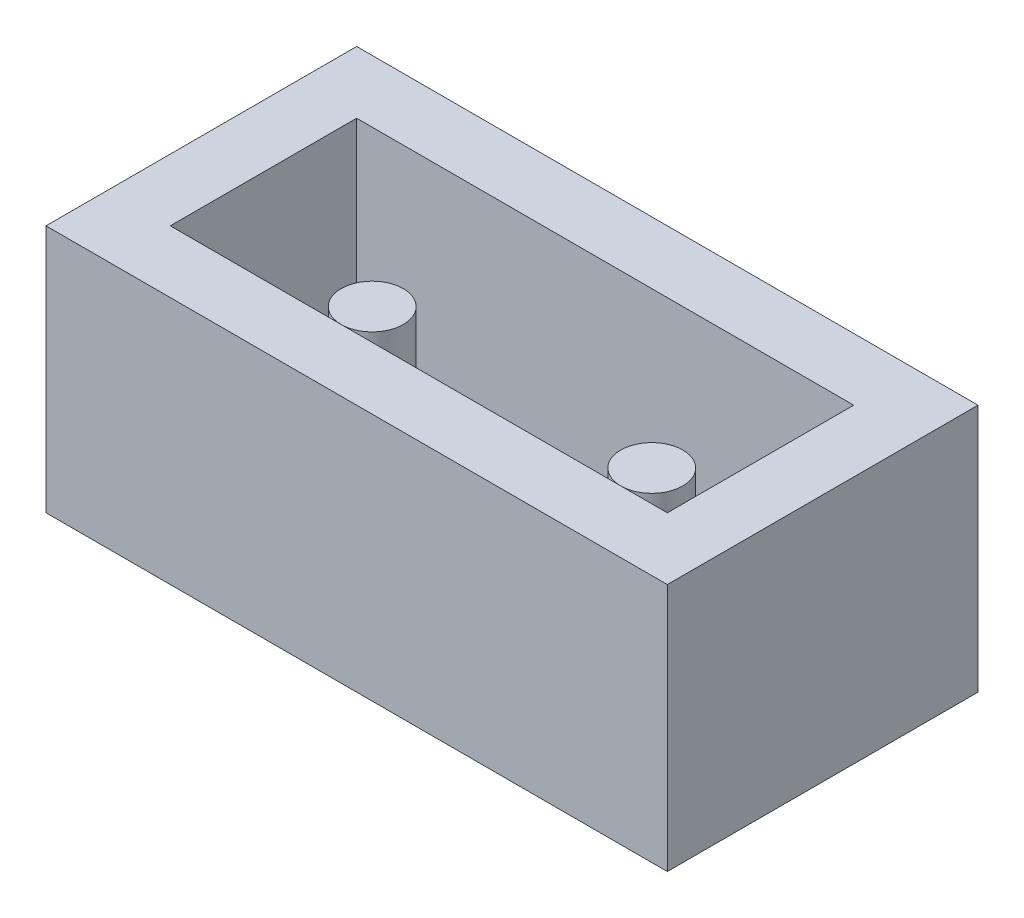
ISO-10303-21;
HEADER;
FILE_DESCRIPTION(('STEP AP214'),'2;1');
FILE_NAME('part.step','',(''),(''),'','','');
FILE_SCHEMA(('AUTOMOTIVE_DESIGN { 1 0 10303 214 1 1 1 1 }'));
ENDSEC;
DATA;
#1=APPLICATION_CONTEXT('core data for automotive mechanical design processes');
#2=APPLICATION_PROTOCOL_DEFINITION('international standard','automotive_design',2000,#1);
#3=PRODUCT_CONTEXT('',#1,'mechanical');
#4=PRODUCT('Part','Part','',(#3));
#5=PRODUCT_RELATED_PRODUCT_CATEGORY('part','',(#4));
#6=PRODUCT_DEFINITION_FORMATION('','',#4);
#7=PRODUCT_DEFINITION_CONTEXT('part definition',#1,'design');
#8=PRODUCT_DEFINITION('design','',#6,#7);
#9=PRODUCT_DEFINITION_SHAPE('','',#8);
#10=(LENGTH_UNIT() NAMED_UNIT(*) SI_UNIT(.MILLI.,.METRE.));
#11=(NAMED_UNIT(*) PLANE_ANGLE_UNIT() SI_UNIT($,.RADIAN.));
#12=(NAMED_UNIT(*) SI_UNIT($,.STERADIAN.) SOLID_ANGLE_UNIT());
#13=UNCERTAINTY_MEASURE_WITH_UNIT(LENGTH_MEASURE(1.E-05),#10,'distance_accuracy_value','');
#14=(GEOMETRIC_REPRESENTATION_CONTEXT(3) GLOBAL_UNCERTAINTY_ASSIGNED_CONTEXT((#13)) GLOBAL_UNIT_ASSIGNED_CONTEXT((#10,
#11,#12)) REPRESENTATION_CONTEXT('',''));
#15=CARTESIAN_POINT('',(0.,0.,0.));
#16=DIRECTION('',(0.,0.,1.));
#17=DIRECTION('',(1.,0.,0.));
#18=AXIS2_PLACEMENT_3D('',#15,#16,#17);
#19=CARTESIAN_POINT('',(0.,5.,0.));
#20=DIRECTION('',(0.,1.,0.));
#21=DIRECTION('',(0.,0.,1.));
#22=AXIS2_PLACEMENT_3D('',#19,#20,#21);
#23=PLANE('',#22);
#24=DIRECTION('',(-1.,0.,0.));
#25=VECTOR('',#24,1.);
#26=CARTESIAN_POINT('',(5.,5.,-2.5));
#27=LINE('',#26,#25);
#28=CARTESIAN_POINT('',(5.,5.,-2.5));
#29=VERTEX_POINT('',#28);
#30=CARTESIAN_POINT('',(-5.,5.,-2.5));
#31=VERTEX_POINT('',#30);
#32=EDGE_CURVE('E145',#29,#31,#27,.T.);
#33=ORIENTED_EDGE('',*,*,#32,.T.);
#34=DIRECTION('',(0.,0.,1.));
#35=VECTOR('',#34,1.);
#36=CARTESIAN_POINT('',(-5.,5.,-2.5));
#37=LINE('',#36,#35);
#38=CARTESIAN_POINT('',(-5.,5.,2.5));
#39=VERTEX_POINT('',#38);
#40=EDGE_CURVE('E148',#31,#39,#37,.T.);
#41=ORIENTED_EDGE('',*,*,#40,.T.);
#42=DIRECTION('',(1.,0.,0.));
#43=VECTOR('',#42,1.);
#44=CARTESIAN_POINT('',(-5.,5.,2.5));
#45=LINE('',#44,#43);
#46=CARTESIAN_POINT('',(5.,5.,2.5));
#47=VERTEX_POINT('',#46);
#48=EDGE_CURVE('E151',#39,#47,#45,.T.);
#49=ORIENTED_EDGE('',*,*,#48,.T.);
#50=DIRECTION('',(0.,0.,-1.));
#51=VECTOR('',#50,1.);
#52=CARTESIAN_POINT('',(5.,5.,2.5));
#53=LINE('',#52,#51);
#54=EDGE_CURVE('E153',#47,#29,#53,.T.);
#55=ORIENTED_EDGE('',*,*,#54,.T.);
#56=EDGE_LOOP('',(#33,#41,#49,#55));
#57=FACE_BOUND('',#56,.T.);
#58=DIRECTION('',(0.,0.,1.));
#59=VECTOR('',#58,1.);
#60=CARTESIAN_POINT('',(-4.,5.,-1.5));
#61=LINE('',#60,#59);
#62=CARTESIAN_POINT('',(-4.,5.,-1.5));
#63=VERTEX_POINT('',#62);
#64=CARTESIAN_POINT('',(-4.,5.,1.5));
#65=VERTEX_POINT('',#64);
#66=EDGE_CURVE('E117',#63,#65,#61,.T.);
#67=ORIENTED_EDGE('',*,*,#66,.F.);
#68=DIRECTION('',(-1.,0.,0.));
#69=VECTOR('',#68,1.);
#70=CARTESIAN_POINT('',(4.,5.,-1.5));
#71=LINE('',#70,#69);
#72=CARTESIAN_POINT('',(4.,5.,-1.5));
#73=VERTEX_POINT('',#72);
#74=EDGE_CURVE('E109',#73,#63,#71,.T.);
#75=ORIENTED_EDGE('',*,*,#74,.F.);
#76=DIRECTION('',(0.,0.,-1.));
#77=VECTOR('',#76,1.);
#78=CARTESIAN_POINT('',(4.,5.,1.5));
#79=LINE('',#78,#77);
#80=CARTESIAN_POINT('',(4.,5.,1.5));
#81=VERTEX_POINT('',#80);
#82=EDGE_CURVE('E131',#81,#73,#79,.T.);
#83=ORIENTED_EDGE('',*,*,#82,.F.);
#84=DIRECTION('',(1.,0.,0.));
#85=VECTOR('',#84,1.);
#86=CARTESIAN_POINT('',(-4.,5.,1.5));
#87=LINE('',#86,#85);
#88=EDGE_CURVE('E129',#65,#81,#87,.T.);
#89=ORIENTED_EDGE('',*,*,#88,.F.);
#90=EDGE_LOOP('',(#67,#75,#83,#89));
#91=FACE_BOUND('',#90,.T.);
#92=ADVANCED_FACE('F44',(#57,#91),#23,.T.);
#93=CARTESIAN_POINT('',(0.,1.,0.));
#94=DIRECTION('',(0.,1.,0.));
#95=DIRECTION('',(0.,0.,1.));
#96=AXIS2_PLACEMENT_3D('',#93,#94,#95);
#97=PLANE('',#96);
#98=DIRECTION('',(-1.,0.,0.));
#99=VECTOR('',#98,1.);
#100=CARTESIAN_POINT('',(5.,1.,-2.5));
#101=LINE('',#100,#99);
#102=CARTESIAN_POINT('',(5.,1.,-2.5));
#103=VERTEX_POINT('',#102);
#104=CARTESIAN_POINT('',(-5.,1.,-2.5));
#105=VERTEX_POINT('',#104);
#106=EDGE_CURVE('E125',#103,#105,#101,.T.);
#107=ORIENTED_EDGE('',*,*,#106,.F.);
#108=DIRECTION('',(0.,0.,-1.));
#109=VECTOR('',#108,1.);
#110=CARTESIAN_POINT('',(5.,1.,2.5));
#111=LINE('',#110,#109);
#112=CARTESIAN_POINT('',(5.,1.,2.5));
#113=VERTEX_POINT('',#112);
#114=EDGE_CURVE('E149',#113,#103,#111,.T.);
#115=ORIENTED_EDGE('',*,*,#114,.F.);
#116=DIRECTION('',(1.,0.,0.));
#117=VECTOR('',#116,1.);
#118=CARTESIAN_POINT('',(-5.,1.,2.5));
#119=LINE('',#118,#117);
#120=CARTESIAN_POINT('',(-5.,1.,2.5));
#121=VERTEX_POINT('',#120);
#122=EDGE_CURVE('E160',#121,#113,#119,.T.);
#123=ORIENTED_EDGE('',*,*,#122,.F.);
#124=DIRECTION('',(0.,0.,1.));
#125=VECTOR('',#124,1.);
#126=CARTESIAN_POINT('',(-5.,1.,-2.5));
#127=LINE('',#126,#125);
#128=EDGE_CURVE('E158',#105,#121,#127,.T.);
#129=ORIENTED_EDGE('',*,*,#128,.F.);
#130=EDGE_LOOP('',(#107,#115,#123,#129));
#131=FACE_BOUND('',#130,.T.);
#132=DIRECTION('',(-1.,0.,0.));
#133=VECTOR('',#132,1.);
#134=CARTESIAN_POINT('',(4.,1.,-1.5));
#135=LINE('',#134,#133);
#136=CARTESIAN_POINT('',(4.,1.,-1.5));
#137=VERTEX_POINT('',#136);
#138=CARTESIAN_POINT('',(-4.,1.,-1.5));
#139=VERTEX_POINT('',#138);
#140=EDGE_CURVE('E67',#137,#139,#135,.T.);
#141=ORIENTED_EDGE('',*,*,#140,.T.);
#142=DIRECTION('',(0.,0.,1.));
#143=VECTOR('',#142,1.);
#144=CARTESIAN_POINT('',(-4.,1.,-1.5));
#145=LINE('',#144,#143);
#146=CARTESIAN_POINT('',(-4.,1.,1.5));
#147=VERTEX_POINT('',#146);
#148=EDGE_CURVE('E124',#139,#147,#145,.T.);
#149=ORIENTED_EDGE('',*,*,#148,.T.);
#150=DIRECTION('',(1.,0.,0.));
#151=VECTOR('',#150,1.);
#152=CARTESIAN_POINT('',(-4.,1.,1.5));
#153=LINE('',#152,#151);
#154=CARTESIAN_POINT('',(4.,1.,1.5));
#155=VERTEX_POINT('',#154);
#156=EDGE_CURVE('E137',#147,#155,#153,.T.);
#157=ORIENTED_EDGE('',*,*,#156,.T.);
#158=DIRECTION('',(0.,0.,-1.));
#159=VECTOR('',#158,1.);
#160=CARTESIAN_POINT('',(4.,1.,1.5));
#161=LINE('',#160,#159);
#162=EDGE_CURVE('E118',#155,#137,#161,.T.);
#163=ORIENTED_EDGE('',*,*,#162,.T.);
#164=EDGE_LOOP('',(#141,#149,#157,#163));
#165=FACE_BOUND('',#164,.T.);
#166=ADVANCED_FACE('F178',(#131,#165),#97,.F.);
#167=CARTESIAN_POINT('',(5.,5.,-2.5));
#168=DIRECTION('',(0.,0.,1.));
#169=DIRECTION('',(1.,0.,0.));
#170=AXIS2_PLACEMENT_3D('',#167,#168,#169);
#171=PLANE('',#170);
#172=ORIENTED_EDGE('',*,*,#106,.T.);
#173=DIRECTION('',(0.,-1.,0.));
#174=VECTOR('',#173,1.);
#175=CARTESIAN_POINT('',(-5.,5.,-2.5));
#176=LINE('',#175,#174);
#177=EDGE_CURVE('E12',#31,#105,#176,.T.);
#178=ORIENTED_EDGE('',*,*,#177,.F.);
#179=ORIENTED_EDGE('',*,*,#32,.F.);
#180=DIRECTION('',(0.,-1.,0.));
#181=VECTOR('',#180,1.);
#182=CARTESIAN_POINT('',(5.,5.,-2.5));
#183=LINE('',#182,#181);
#184=EDGE_CURVE('E155',#29,#103,#183,.T.);
#185=ORIENTED_EDGE('',*,*,#184,.T.);
#186=EDGE_LOOP('',(#172,#178,#179,#185));
#187=FACE_BOUND('',#186,.T.);
#188=ADVANCED_FACE('F46',(#187),#171,.F.);
#189=CARTESIAN_POINT('',(-5.,5.,-2.5));
#190=DIRECTION('',(1.,0.,0.));
#191=DIRECTION('',(0.,0.,-1.));
#192=AXIS2_PLACEMENT_3D('',#189,#190,#191);
#193=PLANE('',#192);
#194=ORIENTED_EDGE('',*,*,#128,.T.);
#195=DIRECTION('',(0.,-1.,0.));
#196=VECTOR('',#195,1.);
#197=CARTESIAN_POINT('',(-5.,5.,2.5));
#198=LINE('',#197,#196);
#199=EDGE_CURVE('E52',#39,#121,#198,.T.);
#200=ORIENTED_EDGE('',*,*,#199,.F.);
#201=ORIENTED_EDGE('',*,*,#40,.F.);
#202=ORIENTED_EDGE('',*,*,#177,.T.);
#203=EDGE_LOOP('',(#194,#200,#201,#202));
#204=FACE_BOUND('',#203,.T.);
#205=ADVANCED_FACE('F188',(#204),#193,.F.);
#206=CARTESIAN_POINT('',(-5.,5.,2.5));
#207=DIRECTION('',(0.,0.,-1.));
#208=DIRECTION('',(-1.,0.,0.));
#209=AXIS2_PLACEMENT_3D('',#206,#207,#208);
#210=PLANE('',#209);
#211=ORIENTED_EDGE('',*,*,#122,.T.);
#212=DIRECTION('',(0.,-1.,0.));
#213=VECTOR('',#212,1.);
#214=CARTESIAN_POINT('',(5.,5.,2.5));
#215=LINE('',#214,#213);
#216=EDGE_CURVE('E165',#47,#113,#215,.T.);
#217=ORIENTED_EDGE('',*,*,#216,.F.);
#218=ORIENTED_EDGE('',*,*,#48,.F.);
#219=ORIENTED_EDGE('',*,*,#199,.T.);
#220=EDGE_LOOP('',(#211,#217,#218,#219));
#221=FACE_BOUND('',#220,.T.);
#222=ADVANCED_FACE('F172',(#221),#210,.F.);
#223=CARTESIAN_POINT('',(5.,5.,2.5));
#224=DIRECTION('',(-1.,0.,0.));
#225=DIRECTION('',(0.,0.,1.));
#226=AXIS2_PLACEMENT_3D('',#223,#224,#225);
#227=PLANE('',#226);
#228=ORIENTED_EDGE('',*,*,#114,.T.);
#229=ORIENTED_EDGE('',*,*,#184,.F.);
#230=ORIENTED_EDGE('',*,*,#54,.F.);
#231=ORIENTED_EDGE('',*,*,#216,.T.);
#232=EDGE_LOOP('',(#228,#229,#230,#231));
#233=FACE_BOUND('',#232,.T.);
#234=ADVANCED_FACE('F182',(#233),#227,.F.);
#235=CARTESIAN_POINT('',(4.,5.,-1.5));
#236=DIRECTION('',(0.,0.,1.));
#237=DIRECTION('',(1.,0.,0.));
#238=AXIS2_PLACEMENT_3D('',#235,#236,#237);
#239=PLANE('',#238);
#240=ORIENTED_EDGE('',*,*,#140,.F.);
#241=DIRECTION('',(0.,-1.,0.));
#242=VECTOR('',#241,1.);
#243=CARTESIAN_POINT('',(4.,5.,-1.5));
#244=LINE('',#243,#242);
#245=EDGE_CURVE('E113',#73,#137,#244,.T.);
#246=ORIENTED_EDGE('',*,*,#245,.F.);
#247=ORIENTED_EDGE('',*,*,#74,.T.);
#248=DIRECTION('',(0.,-1.,0.));
#249=VECTOR('',#248,1.);
#250=CARTESIAN_POINT('',(-4.,5.,-1.5));
#251=LINE('',#250,#249);
#252=EDGE_CURVE('E112',#63,#139,#251,.T.);
#253=ORIENTED_EDGE('',*,*,#252,.T.);
#254=EDGE_LOOP('',(#240,#246,#247,#253));
#255=FACE_BOUND('',#254,.T.);
#256=ADVANCED_FACE('F111',(#255),#239,.T.);
#257=CARTESIAN_POINT('',(-4.,5.,-1.5));
#258=DIRECTION('',(1.,0.,0.));
#259=DIRECTION('',(0.,0.,-1.));
#260=AXIS2_PLACEMENT_3D('',#257,#258,#259);
#261=PLANE('',#260);
#262=ORIENTED_EDGE('',*,*,#148,.F.);
#263=ORIENTED_EDGE('',*,*,#252,.F.);
#264=ORIENTED_EDGE('',*,*,#66,.T.);
#265=DIRECTION('',(0.,-1.,0.));
#266=VECTOR('',#265,1.);
#267=CARTESIAN_POINT('',(-4.,5.,1.5));
#268=LINE('',#267,#266);
#269=EDGE_CURVE('E126',#65,#147,#268,.T.);
#270=ORIENTED_EDGE('',*,*,#269,.T.);
#271=EDGE_LOOP('',(#262,#263,#264,#270));
#272=FACE_BOUND('',#271,.T.);
#273=ADVANCED_FACE('F121',(#272),#261,.T.);
#274=CARTESIAN_POINT('',(-4.,5.,1.5));
#275=DIRECTION('',(0.,0.,-1.));
#276=DIRECTION('',(-1.,0.,0.));
#277=AXIS2_PLACEMENT_3D('',#274,#275,#276);
#278=PLANE('',#277);
#279=ORIENTED_EDGE('',*,*,#156,.F.);
#280=ORIENTED_EDGE('',*,*,#269,.F.);
#281=ORIENTED_EDGE('',*,*,#88,.T.);
#282=DIRECTION('',(0.,-1.,0.));
#283=VECTOR('',#282,1.);
#284=CARTESIAN_POINT('',(4.,5.,1.5));
#285=LINE('',#284,#283);
#286=EDGE_CURVE('E59',#81,#155,#285,.T.);
#287=ORIENTED_EDGE('',*,*,#286,.T.);
#288=EDGE_LOOP('',(#279,#280,#281,#287));
#289=FACE_BOUND('',#288,.T.);
#290=ADVANCED_FACE('F211',(#289),#278,.T.);
#291=CARTESIAN_POINT('',(4.,5.,1.5));
#292=DIRECTION('',(-1.,0.,0.));
#293=DIRECTION('',(0.,0.,1.));
#294=AXIS2_PLACEMENT_3D('',#291,#292,#293);
#295=PLANE('',#294);
#296=ORIENTED_EDGE('',*,*,#162,.F.);
#297=ORIENTED_EDGE('',*,*,#286,.F.);
#298=ORIENTED_EDGE('',*,*,#82,.T.);
#299=ORIENTED_EDGE('',*,*,#245,.T.);
#300=EDGE_LOOP('',(#296,#297,#298,#299));
#301=FACE_BOUND('',#300,.T.);
#302=ADVANCED_FACE('F215',(#301),#295,.T.);
#303=CLOSED_SHELL('',(#92,#166,#188,#205,#222,#234,#256,#273,#290,#302));
#304=MANIFOLD_SOLID_BREP('B2',#303);
#305=CARTESIAN_POINT('',(-4.,1.,1.5));
#306=DIRECTION('',(1.,0.,0.));
#307=DIRECTION('',(0.,0.,-1.));
#308=AXIS2_PLACEMENT_3D('',#305,#306,#307);
#309=PLANE('',#308);
#310=DIRECTION('',(0.,0.,1.));
#311=VECTOR('',#310,1.);
#312=CARTESIAN_POINT('',(-4.,0.,1.5));
#313=LINE('',#312,#311);
#314=CARTESIAN_POINT('',(-4.,0.,-1.5));
#315=VERTEX_POINT('',#314);
#316=CARTESIAN_POINT('',(-4.,0.,1.5));
#317=VERTEX_POINT('',#316);
#318=EDGE_CURVE('E336',#315,#317,#313,.T.);
#319=ORIENTED_EDGE('',*,*,#318,.T.);
#320=DIRECTION('',(0.,-1.,0.));
#321=VECTOR('',#320,1.);
#322=CARTESIAN_POINT('',(-4.,1.,1.5));
#323=LINE('',#322,#321);
#324=CARTESIAN_POINT('',(-4.,1.,1.5));
#325=VERTEX_POINT('',#324);
#326=EDGE_CURVE('E42',#325,#317,#323,.T.);
#327=ORIENTED_EDGE('',*,*,#326,.F.);
#328=DIRECTION('',(0.,0.,1.));
#329=VECTOR('',#328,1.);
#330=CARTESIAN_POINT('',(-4.,1.,1.5));
#331=LINE('',#330,#329);
#332=CARTESIAN_POINT('',(-4.,1.,-1.5));
#333=VERTEX_POINT('',#332);
#334=EDGE_CURVE('E324',#333,#325,#331,.T.);
#335=ORIENTED_EDGE('',*,*,#334,.F.);
#336=DIRECTION('',(0.,-1.,0.));
#337=VECTOR('',#336,1.);
#338=CARTESIAN_POINT('',(-4.,1.,-1.5));
#339=LINE('',#338,#337);
#340=EDGE_CURVE('E332',#333,#315,#339,.T.);
#341=ORIENTED_EDGE('',*,*,#340,.T.);
#342=EDGE_LOOP('',(#319,#327,#335,#341));
#343=FACE_BOUND('',#342,.T.);
#344=ADVANCED_FACE('F273',(#343),#309,.F.);
#345=CARTESIAN_POINT('',(4.,1.,1.5));
#346=DIRECTION('',(0.,0.,-1.));
#347=DIRECTION('',(-1.,0.,0.));
#348=AXIS2_PLACEMENT_3D('',#345,#346,#347);
#349=PLANE('',#348);
#350=DIRECTION('',(1.,0.,0.));
#351=VECTOR('',#350,1.);
#352=CARTESIAN_POINT('',(4.,0.,1.5));
#353=LINE('',#352,#351);
#354=CARTESIAN_POINT('',(4.,0.,1.5));
#355=VERTEX_POINT('',#354);
#356=EDGE_CURVE('E328',#317,#355,#353,.T.);
#357=ORIENTED_EDGE('',*,*,#356,.T.);
#358=DIRECTION('',(0.,-1.,0.));
#359=VECTOR('',#358,1.);
#360=CARTESIAN_POINT('',(4.,1.,1.5));
#361=LINE('',#360,#359);
#362=CARTESIAN_POINT('',(4.,1.,1.5));
#363=VERTEX_POINT('',#362);
#364=EDGE_CURVE('E281',#363,#355,#361,.T.);
#365=ORIENTED_EDGE('',*,*,#364,.F.);
#366=DIRECTION('',(1.,0.,0.));
#367=VECTOR('',#366,1.);
#368=CARTESIAN_POINT('',(4.,1.,1.5));
#369=LINE('',#368,#367);
#370=EDGE_CURVE('E319',#325,#363,#369,.T.);
#371=ORIENTED_EDGE('',*,*,#370,.F.);
#372=ORIENTED_EDGE('',*,*,#326,.T.);
#373=EDGE_LOOP('',(#357,#365,#371,#372));
#374=FACE_BOUND('',#373,.T.);
#375=ADVANCED_FACE('F327',(#374),#349,.F.);
#376=CARTESIAN_POINT('',(4.,1.,1.5));
#377=DIRECTION('',(-1.,0.,0.));
#378=DIRECTION('',(0.,0.,1.));
#379=AXIS2_PLACEMENT_3D('',#376,#377,#378);
#380=PLANE('',#379);
#381=DIRECTION('',(0.,0.,-1.));
#382=VECTOR('',#381,1.);
#383=CARTESIAN_POINT('',(4.,0.,1.5));
#384=LINE('',#383,#382);
#385=CARTESIAN_POINT('',(4.,0.,-1.5));
#386=VERTEX_POINT('',#385);
#387=EDGE_CURVE('E306',#355,#386,#384,.T.);
#388=ORIENTED_EDGE('',*,*,#387,.T.);
#389=DIRECTION('',(0.,-1.,0.));
#390=VECTOR('',#389,1.);
#391=CARTESIAN_POINT('',(4.,1.,-1.5));
#392=LINE('',#391,#390);
#393=CARTESIAN_POINT('',(4.,1.,-1.5));
#394=VERTEX_POINT('',#393);
#395=EDGE_CURVE('E329',#394,#386,#392,.T.);
#396=ORIENTED_EDGE('',*,*,#395,.F.);
#397=DIRECTION('',(0.,0.,-1.));
#398=VECTOR('',#397,1.);
#399=CARTESIAN_POINT('',(4.,1.,1.5));
#400=LINE('',#399,#398);
#401=EDGE_CURVE('E322',#363,#394,#400,.T.);
#402=ORIENTED_EDGE('',*,*,#401,.F.);
#403=ORIENTED_EDGE('',*,*,#364,.T.);
#404=EDGE_LOOP('',(#388,#396,#402,#403));
#405=FACE_BOUND('',#404,.T.);
#406=ADVANCED_FACE('F330',(#405),#380,.F.);
#407=CARTESIAN_POINT('',(4.,1.,-1.5));
#408=DIRECTION('',(0.,0.,1.));
#409=DIRECTION('',(1.,0.,0.));
#410=AXIS2_PLACEMENT_3D('',#407,#408,#409);
#411=PLANE('',#410);
#412=DIRECTION('',(-1.,0.,0.));
#413=VECTOR('',#412,1.);
#414=CARTESIAN_POINT('',(4.,0.,-1.5));
#415=LINE('',#414,#413);
#416=EDGE_CURVE('E312',#386,#315,#415,.T.);
#417=ORIENTED_EDGE('',*,*,#416,.T.);
#418=ORIENTED_EDGE('',*,*,#340,.F.);
#419=DIRECTION('',(-1.,0.,0.));
#420=VECTOR('',#419,1.);
#421=CARTESIAN_POINT('',(4.,1.,-1.5));
#422=LINE('',#421,#420);
#423=EDGE_CURVE('E289',#394,#333,#422,.T.);
#424=ORIENTED_EDGE('',*,*,#423,.F.);
#425=ORIENTED_EDGE('',*,*,#395,.T.);
#426=EDGE_LOOP('',(#417,#418,#424,#425));
#427=FACE_BOUND('',#426,.T.);
#428=ADVANCED_FACE('F344',(#427),#411,.F.);
#429=CARTESIAN_POINT('',(0.,1.,0.));
#430=DIRECTION('',(0.,1.,0.));
#431=DIRECTION('',(0.,0.,1.));
#432=AXIS2_PLACEMENT_3D('',#429,#430,#431);
#433=PLANE('',#432);
#434=CARTESIAN_POINT('',(2.25,1.,0.));
#435=DIRECTION('',(0.,1.,0.));
#436=DIRECTION('',(0.,0.,-1.));
#437=AXIS2_PLACEMENT_3D('',#434,#435,#436);
#438=CIRCLE('',#437,0.5);
#439=CARTESIAN_POINT('',(2.25,1.,-0.5));
#440=VERTEX_POINT('',#439);
#441=EDGE_CURVE('E356',#440,#440,#438,.T.);
#442=ORIENTED_EDGE('',*,*,#441,.F.);
#443=EDGE_LOOP('',(#442));
#444=FACE_BOUND('',#443,.T.);
#445=CARTESIAN_POINT('',(-2.25,1.,0.));
#446=DIRECTION('',(0.,1.,0.));
#447=DIRECTION('',(0.,0.,1.));
#448=AXIS2_PLACEMENT_3D('',#445,#446,#447);
#449=CIRCLE('',#448,0.5);
#450=CARTESIAN_POINT('',(-2.25,1.,0.5));
#451=VERTEX_POINT('',#450);
#452=EDGE_CURVE('E350',#451,#451,#449,.T.);
#453=ORIENTED_EDGE('',*,*,#452,.F.);
#454=EDGE_LOOP('',(#453));
#455=FACE_BOUND('',#454,.T.);
#456=ORIENTED_EDGE('',*,*,#334,.T.);
#457=ORIENTED_EDGE('',*,*,#370,.T.);
#458=ORIENTED_EDGE('',*,*,#401,.T.);
#459=ORIENTED_EDGE('',*,*,#423,.T.);
#460=EDGE_LOOP('',(#456,#457,#458,#459));
#461=FACE_BOUND('',#460,.T.);
#462=ADVANCED_FACE('F320',(#444,#455,#461),#433,.T.);
#463=CARTESIAN_POINT('',(0.,0.,0.));
#464=DIRECTION('',(0.,1.,0.));
#465=DIRECTION('',(0.,0.,1.));
#466=AXIS2_PLACEMENT_3D('',#463,#464,#465);
#467=PLANE('',#466);
#468=ORIENTED_EDGE('',*,*,#318,.F.);
#469=ORIENTED_EDGE('',*,*,#416,.F.);
#470=ORIENTED_EDGE('',*,*,#387,.F.);
#471=ORIENTED_EDGE('',*,*,#356,.F.);
#472=EDGE_LOOP('',(#468,#469,#470,#471));
#473=FACE_BOUND('',#472,.T.);
#474=ADVANCED_FACE('F347',(#473),#467,.F.);
#475=CARTESIAN_POINT('',(-2.25,4.,0.));
#476=DIRECTION('',(0.,-1.,0.));
#477=DIRECTION('',(0.,0.,-1.));
#478=AXIS2_PLACEMENT_3D('',#475,#476,#477);
#479=CYLINDRICAL_SURFACE('',#478,0.5);
#480=CARTESIAN_POINT('',(-2.25,4.,0.));
#481=DIRECTION('',(0.,1.,0.));
#482=DIRECTION('',(0.,0.,1.));
#483=AXIS2_PLACEMENT_3D('',#480,#481,#482);
#484=CIRCLE('',#483,0.5);
#485=CARTESIAN_POINT('',(-2.25,4.,0.5));
#486=VERTEX_POINT('',#485);
#487=EDGE_CURVE('E339',#486,#486,#484,.T.);
#488=ORIENTED_EDGE('',*,*,#487,.F.);
#489=EDGE_LOOP('',(#488));
#490=FACE_BOUND('',#489,.T.);
#491=ORIENTED_EDGE('',*,*,#452,.T.);
#492=EDGE_LOOP('',(#491));
#493=FACE_BOUND('',#492,.T.);
#494=ADVANCED_FACE('F376',(#490,#493),#479,.T.);
#495=CARTESIAN_POINT('',(-2.25,4.,0.));
#496=DIRECTION('',(0.,1.,0.));
#497=DIRECTION('',(0.,0.,1.));
#498=AXIS2_PLACEMENT_3D('',#495,#496,#497);
#499=PLANE('',#498);
#500=ORIENTED_EDGE('',*,*,#487,.T.);
#501=EDGE_LOOP('',(#500));
#502=FACE_BOUND('',#501,.T.);
#503=ADVANCED_FACE('F367',(#502),#499,.T.);
#504=CARTESIAN_POINT('',(2.25,4.,0.));
#505=DIRECTION('',(0.,-1.,0.));
#506=DIRECTION('',(0.,0.,-1.));
#507=AXIS2_PLACEMENT_3D('',#504,#505,#506);
#508=CYLINDRICAL_SURFACE('',#507,0.5);
#509=CARTESIAN_POINT('',(2.25,4.,0.));
#510=DIRECTION('',(0.,1.,0.));
#511=DIRECTION('',(0.,0.,-1.));
#512=AXIS2_PLACEMENT_3D('',#509,#510,#511);
#513=CIRCLE('',#512,0.5);
#514=CARTESIAN_POINT('',(2.25,4.,-0.5));
#515=VERTEX_POINT('',#514);
#516=EDGE_CURVE('E353',#515,#515,#513,.T.);
#517=ORIENTED_EDGE('',*,*,#516,.F.);
#518=EDGE_LOOP('',(#517));
#519=FACE_BOUND('',#518,.T.);
#520=ORIENTED_EDGE('',*,*,#441,.T.);
#521=EDGE_LOOP('',(#520));
#522=FACE_BOUND('',#521,.T.);
#523=ADVANCED_FACE('F364',(#519,#522),#508,.T.);
#524=CARTESIAN_POINT('',(2.25,4.,0.));
#525=DIRECTION('',(0.,-1.,0.));
#526=DIRECTION('',(0.,0.,-1.));
#527=AXIS2_PLACEMENT_3D('',#524,#525,#526);
#528=PLANE('',#527);
#529=ORIENTED_EDGE('',*,*,#516,.T.);
#530=EDGE_LOOP('',(#529));
#531=FACE_BOUND('',#530,.T.);
#532=ADVANCED_FACE('F362',(#531),#528,.F.);
#533=CLOSED_SHELL('',(#344,#375,#406,#428,#462,#474,#494,#503,#523,#532));
#534=MANIFOLD_SOLID_BREP('B6',#533);
#535=ADVANCED_BREP_SHAPE_REPRESENTATION('',(#18,#304,#534),#14);
#536=SHAPE_DEFINITION_REPRESENTATION(#9,#535);
ENDSEC;
END-ISO-10303-21;
